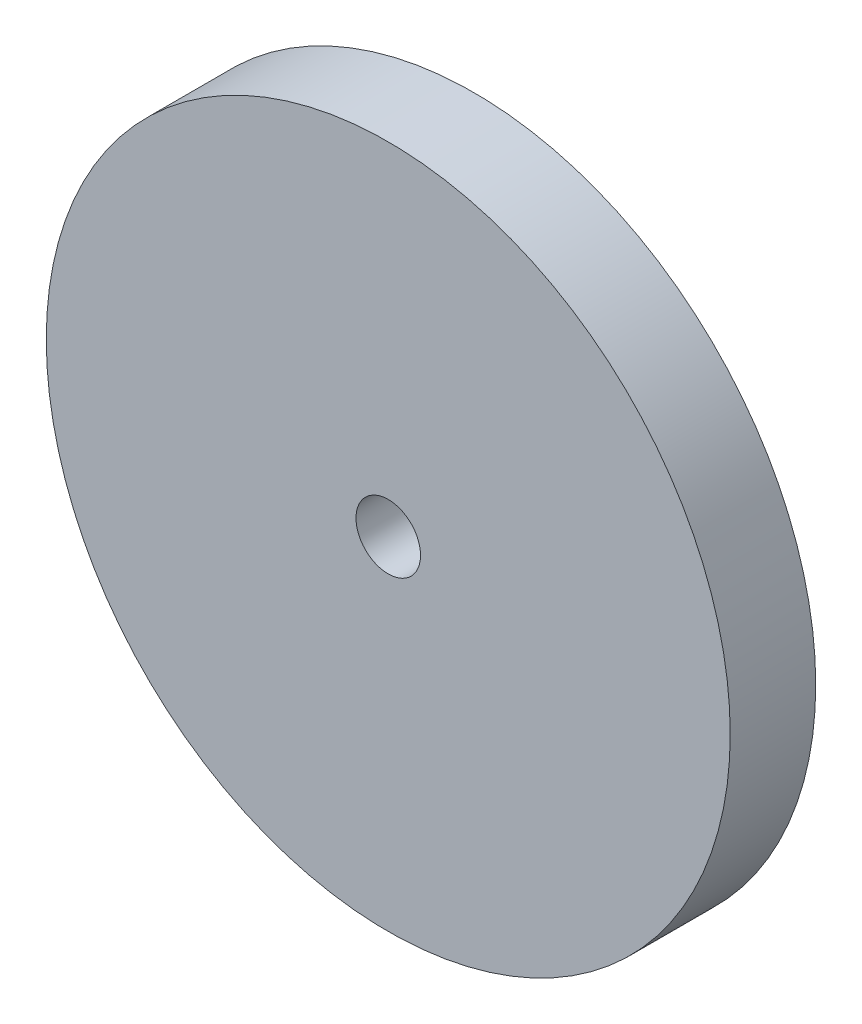
ISO-10303-21;
HEADER;
FILE_DESCRIPTION(('STEP AP214'),'2;1');
FILE_NAME('part.step','',(''),(''),'','','');
FILE_SCHEMA(('AUTOMOTIVE_DESIGN { 1 0 10303 214 1 1 1 1 }'));
ENDSEC;
DATA;
#1=APPLICATION_CONTEXT('core data for automotive mechanical design processes');
#2=APPLICATION_PROTOCOL_DEFINITION('international standard','automotive_design',2000,#1);
#3=PRODUCT_CONTEXT('',#1,'mechanical');
#4=PRODUCT('Part','Part','',(#3));
#5=PRODUCT_RELATED_PRODUCT_CATEGORY('part','',(#4));
#6=PRODUCT_DEFINITION_FORMATION('','',#4);
#7=PRODUCT_DEFINITION_CONTEXT('part definition',#1,'design');
#8=PRODUCT_DEFINITION('design','',#6,#7);
#9=PRODUCT_DEFINITION_SHAPE('','',#8);
#10=(LENGTH_UNIT() NAMED_UNIT(*) SI_UNIT(.MILLI.,.METRE.));
#11=(NAMED_UNIT(*) PLANE_ANGLE_UNIT() SI_UNIT($,.RADIAN.));
#12=(NAMED_UNIT(*) SI_UNIT($,.STERADIAN.) SOLID_ANGLE_UNIT());
#13=UNCERTAINTY_MEASURE_WITH_UNIT(LENGTH_MEASURE(1.E-05),#10,'distance_accuracy_value','');
#14=(GEOMETRIC_REPRESENTATION_CONTEXT(3) GLOBAL_UNCERTAINTY_ASSIGNED_CONTEXT((#13)) GLOBAL_UNIT_ASSIGNED_CONTEXT((#10,
#11,#12)) REPRESENTATION_CONTEXT('',''));
#15=CARTESIAN_POINT('',(0.,0.,0.));
#16=DIRECTION('',(0.,0.,1.));
#17=DIRECTION('',(1.,0.,0.));
#18=AXIS2_PLACEMENT_3D('',#15,#16,#17);
#19=CARTESIAN_POINT('',(0.,0.,10.));
#20=DIRECTION('',(0.,0.,1.));
#21=DIRECTION('',(1.,0.,0.));
#22=AXIS2_PLACEMENT_3D('',#19,#20,#21);
#23=PLANE('',#22);
#24=CARTESIAN_POINT('',(0.,0.,10.));
#25=DIRECTION('',(0.,0.,1.));
#26=DIRECTION('',(1.,0.,0.));
#27=AXIS2_PLACEMENT_3D('',#24,#25,#26);
#28=CIRCLE('',#27,40.);
#29=CARTESIAN_POINT('',(40.,0.,10.));
#30=VERTEX_POINT('',#29);
#31=EDGE_CURVE('E10',#30,#30,#28,.T.);
#32=ORIENTED_EDGE('',*,*,#31,.T.);
#33=EDGE_LOOP('',(#32));
#34=FACE_BOUND('',#33,.T.);
#35=CARTESIAN_POINT('',(0.,0.,10.));
#36=DIRECTION('',(0.,0.,1.));
#37=DIRECTION('',(1.,0.,0.));
#38=AXIS2_PLACEMENT_3D('',#35,#36,#37);
#39=CIRCLE('',#38,3.775);
#40=CARTESIAN_POINT('',(3.775,0.,10.));
#41=VERTEX_POINT('',#40);
#42=EDGE_CURVE('E42',#41,#41,#39,.T.);
#43=ORIENTED_EDGE('',*,*,#42,.F.);
#44=EDGE_LOOP('',(#43));
#45=FACE_BOUND('',#44,.T.);
#46=ADVANCED_FACE('F31',(#34,#45),#23,.T.);
#47=CARTESIAN_POINT('',(0.,0.,0.));
#48=DIRECTION('',(0.,0.,1.));
#49=DIRECTION('',(1.,0.,0.));
#50=AXIS2_PLACEMENT_3D('',#47,#48,#49);
#51=PLANE('',#50);
#52=CARTESIAN_POINT('',(0.,0.,0.));
#53=DIRECTION('',(0.,0.,1.));
#54=DIRECTION('',(1.,0.,0.));
#55=AXIS2_PLACEMENT_3D('',#52,#53,#54);
#56=CIRCLE('',#55,40.);
#57=CARTESIAN_POINT('',(40.,0.,0.));
#58=VERTEX_POINT('',#57);
#59=EDGE_CURVE('E35',#58,#58,#56,.T.);
#60=ORIENTED_EDGE('',*,*,#59,.F.);
#61=EDGE_LOOP('',(#60));
#62=FACE_BOUND('',#61,.T.);
#63=CARTESIAN_POINT('',(0.,0.,0.));
#64=DIRECTION('',(0.,0.,1.));
#65=DIRECTION('',(1.,0.,0.));
#66=AXIS2_PLACEMENT_3D('',#63,#64,#65);
#67=CIRCLE('',#66,3.775);
#68=CARTESIAN_POINT('',(3.775,0.,0.));
#69=VERTEX_POINT('',#68);
#70=EDGE_CURVE('E44',#69,#69,#67,.T.);
#71=ORIENTED_EDGE('',*,*,#70,.T.);
#72=EDGE_LOOP('',(#71));
#73=FACE_BOUND('',#72,.T.);
#74=ADVANCED_FACE('F54',(#62,#73),#51,.F.);
#75=CARTESIAN_POINT('',(0.,0.,10.));
#76=DIRECTION('',(0.,0.,-1.));
#77=DIRECTION('',(-1.,0.,0.));
#78=AXIS2_PLACEMENT_3D('',#75,#76,#77);
#79=CYLINDRICAL_SURFACE('',#78,40.);
#80=ORIENTED_EDGE('',*,*,#31,.F.);
#81=EDGE_LOOP('',(#80));
#82=FACE_BOUND('',#81,.T.);
#83=ORIENTED_EDGE('',*,*,#59,.T.);
#84=EDGE_LOOP('',(#83));
#85=FACE_BOUND('',#84,.T.);
#86=ADVANCED_FACE('F33',(#82,#85),#79,.T.);
#87=CARTESIAN_POINT('',(0.,0.,10.));
#88=DIRECTION('',(0.,0.,-1.));
#89=DIRECTION('',(-1.,0.,0.));
#90=AXIS2_PLACEMENT_3D('',#87,#88,#89);
#91=CYLINDRICAL_SURFACE('',#90,3.775);
#92=ORIENTED_EDGE('',*,*,#42,.T.);
#93=EDGE_LOOP('',(#92));
#94=FACE_BOUND('',#93,.T.);
#95=ORIENTED_EDGE('',*,*,#70,.F.);
#96=EDGE_LOOP('',(#95));
#97=FACE_BOUND('',#96,.T.);
#98=ADVANCED_FACE('F50',(#94,#97),#91,.F.);
#99=CLOSED_SHELL('',(#46,#74,#86,#98));
#100=MANIFOLD_SOLID_BREP('B2',#99);
#101=ADVANCED_BREP_SHAPE_REPRESENTATION('',(#18,#100),#14);
#102=SHAPE_DEFINITION_REPRESENTATION(#9,#101);
ENDSEC;
END-ISO-10303-21;
